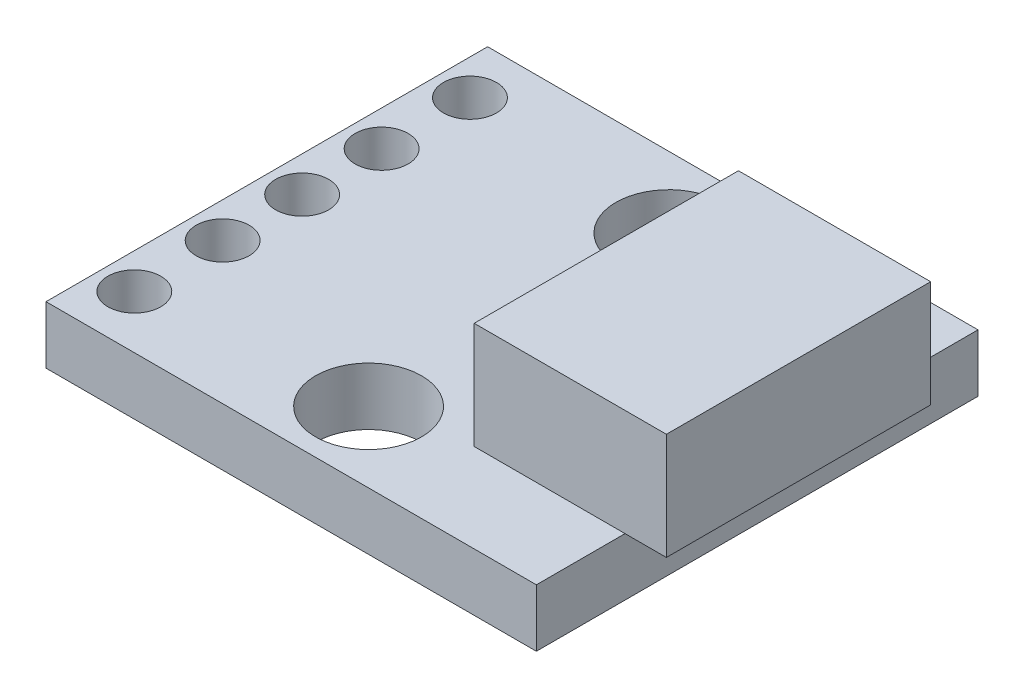
ISO-10303-21;
HEADER;
FILE_DESCRIPTION(('STEP AP214'),'2;1');
FILE_NAME('part.step','',(''),(''),'','','');
FILE_SCHEMA(('AUTOMOTIVE_DESIGN { 1 0 10303 214 1 1 1 1 }'));
ENDSEC;
DATA;
#1=APPLICATION_CONTEXT('core data for automotive mechanical design processes');
#2=APPLICATION_PROTOCOL_DEFINITION('international standard','automotive_design',2000,#1);
#3=PRODUCT_CONTEXT('',#1,'mechanical');
#4=PRODUCT('Part','Part','',(#3));
#5=PRODUCT_RELATED_PRODUCT_CATEGORY('part','',(#4));
#6=PRODUCT_DEFINITION_FORMATION('','',#4);
#7=PRODUCT_DEFINITION_CONTEXT('part definition',#1,'design');
#8=PRODUCT_DEFINITION('design','',#6,#7);
#9=PRODUCT_DEFINITION_SHAPE('','',#8);
#10=(LENGTH_UNIT() NAMED_UNIT(*) SI_UNIT(.MILLI.,.METRE.));
#11=(NAMED_UNIT(*) PLANE_ANGLE_UNIT() SI_UNIT($,.RADIAN.));
#12=(NAMED_UNIT(*) SI_UNIT($,.STERADIAN.) SOLID_ANGLE_UNIT());
#13=UNCERTAINTY_MEASURE_WITH_UNIT(LENGTH_MEASURE(1.E-05),#10,'distance_accuracy_value','');
#14=(GEOMETRIC_REPRESENTATION_CONTEXT(3) GLOBAL_UNCERTAINTY_ASSIGNED_CONTEXT((#13)) GLOBAL_UNIT_ASSIGNED_CONTEXT((#10,
#11,#12)) REPRESENTATION_CONTEXT('',''));
#15=CARTESIAN_POINT('',(0.,0.,0.));
#16=DIRECTION('',(0.,0.,1.));
#17=DIRECTION('',(1.,0.,0.));
#18=AXIS2_PLACEMENT_3D('',#15,#16,#17);
#19=CARTESIAN_POINT('',(5.39,1.63,0.));
#20=DIRECTION('',(0.,1.,0.));
#21=DIRECTION('',(0.,0.,1.));
#22=AXIS2_PLACEMENT_3D('',#19,#20,#21);
#23=PLANE('',#22);
#24=DIRECTION('',(0.,0.,-1.));
#25=VECTOR('',#24,1.);
#26=CARTESIAN_POINT('',(8.11,1.63,3.74));
#27=LINE('',#26,#25);
#28=CARTESIAN_POINT('',(8.11,1.63,3.74));
#29=VERTEX_POINT('',#28);
#30=CARTESIAN_POINT('',(8.11,1.63,-3.74));
#31=VERTEX_POINT('',#30);
#32=EDGE_CURVE('P0_E78',#29,#31,#27,.T.);
#33=ORIENTED_EDGE('',*,*,#32,.F.);
#34=DIRECTION('',(1.,0.,0.));
#35=VECTOR('',#34,1.);
#36=CARTESIAN_POINT('',(2.67,1.63,3.74));
#37=LINE('',#36,#35);
#38=CARTESIAN_POINT('',(2.67,1.63,3.74));
#39=VERTEX_POINT('',#38);
#40=EDGE_CURVE('P0_E54',#39,#29,#37,.T.);
#41=ORIENTED_EDGE('',*,*,#40,.F.);
#42=DIRECTION('',(0.,0.,1.));
#43=VECTOR('',#42,1.);
#44=CARTESIAN_POINT('',(2.67,1.63,-3.74));
#45=LINE('',#44,#43);
#46=CARTESIAN_POINT('',(2.67,1.63,-3.74));
#47=VERTEX_POINT('',#46);
#48=EDGE_CURVE('P0_E56',#47,#39,#45,.T.);
#49=ORIENTED_EDGE('',*,*,#48,.F.);
#50=DIRECTION('',(-1.,0.,0.));
#51=VECTOR('',#50,1.);
#52=CARTESIAN_POINT('',(8.11,1.63,-3.74));
#53=LINE('',#52,#51);
#54=EDGE_CURVE('P0_E19',#31,#47,#53,.T.);
#55=ORIENTED_EDGE('',*,*,#54,.F.);
#56=EDGE_LOOP('',(#33,#41,#49,#55));
#57=FACE_BOUND('',#56,.T.);
#58=ADVANCED_FACE('P0_F16',(#57),#23,.F.);
#59=CARTESIAN_POINT('',(8.11,1.63,-3.74));
#60=DIRECTION('',(0.,0.,-1.));
#61=DIRECTION('',(-1.,0.,0.));
#62=AXIS2_PLACEMENT_3D('',#59,#60,#61);
#63=PLANE('',#62);
#64=DIRECTION('',(1.,0.,0.));
#65=VECTOR('',#64,1.);
#66=CARTESIAN_POINT('',(5.39,4.65,-3.74));
#67=LINE('',#66,#65);
#68=CARTESIAN_POINT('',(8.11,4.65,-3.74));
#69=VERTEX_POINT('',#68);
#70=CARTESIAN_POINT('',(2.67,4.65,-3.74));
#71=VERTEX_POINT('',#70);
#72=EDGE_CURVE('P0_E82',#69,#71,#67,.F.);
#73=ORIENTED_EDGE('',*,*,#72,.F.);
#74=DIRECTION('',(0.,1.,0.));
#75=VECTOR('',#74,1.);
#76=CARTESIAN_POINT('',(8.11,1.63,-3.74));
#77=LINE('',#76,#75);
#78=EDGE_CURVE('P0_E67',#31,#69,#77,.T.);
#79=ORIENTED_EDGE('',*,*,#78,.F.);
#80=ORIENTED_EDGE('',*,*,#54,.T.);
#81=DIRECTION('',(0.,1.,0.));
#82=VECTOR('',#81,1.);
#83=CARTESIAN_POINT('',(2.67,1.63,-3.74));
#84=LINE('',#83,#82);
#85=EDGE_CURVE('P0_E62',#71,#47,#84,.F.);
#86=ORIENTED_EDGE('',*,*,#85,.F.);
#87=EDGE_LOOP('',(#73,#79,#80,#86));
#88=FACE_BOUND('',#87,.T.);
#89=ADVANCED_FACE('P0_F64',(#88),#63,.T.);
#90=CARTESIAN_POINT('',(2.67,1.63,-3.74));
#91=DIRECTION('',(-1.,0.,0.));
#92=DIRECTION('',(0.,0.,1.));
#93=AXIS2_PLACEMENT_3D('',#90,#91,#92);
#94=PLANE('',#93);
#95=DIRECTION('',(0.,0.,1.));
#96=VECTOR('',#95,1.);
#97=CARTESIAN_POINT('',(2.67,4.65,0.));
#98=LINE('',#97,#96);
#99=CARTESIAN_POINT('',(2.67,4.65,3.74));
#100=VERTEX_POINT('',#99);
#101=EDGE_CURVE('P0_E71',#71,#100,#98,.T.);
#102=ORIENTED_EDGE('',*,*,#101,.F.);
#103=ORIENTED_EDGE('',*,*,#85,.T.);
#104=ORIENTED_EDGE('',*,*,#48,.T.);
#105=DIRECTION('',(0.,1.,0.));
#106=VECTOR('',#105,1.);
#107=CARTESIAN_POINT('',(2.67,1.63,3.74));
#108=LINE('',#107,#106);
#109=EDGE_CURVE('P0_E74',#100,#39,#108,.F.);
#110=ORIENTED_EDGE('',*,*,#109,.F.);
#111=EDGE_LOOP('',(#102,#103,#104,#110));
#112=FACE_BOUND('',#111,.T.);
#113=ADVANCED_FACE('P0_F69',(#112),#94,.T.);
#114=CARTESIAN_POINT('',(2.67,1.63,3.74));
#115=DIRECTION('',(0.,0.,1.));
#116=DIRECTION('',(1.,0.,0.));
#117=AXIS2_PLACEMENT_3D('',#114,#115,#116);
#118=PLANE('',#117);
#119=DIRECTION('',(1.,0.,0.));
#120=VECTOR('',#119,1.);
#121=CARTESIAN_POINT('',(5.39,4.65,3.74));
#122=LINE('',#121,#120);
#123=CARTESIAN_POINT('',(8.11,4.65,3.74));
#124=VERTEX_POINT('',#123);
#125=EDGE_CURVE('P0_E25',#100,#124,#122,.T.);
#126=ORIENTED_EDGE('',*,*,#125,.F.);
#127=ORIENTED_EDGE('',*,*,#109,.T.);
#128=ORIENTED_EDGE('',*,*,#40,.T.);
#129=DIRECTION('',(0.,1.,0.));
#130=VECTOR('',#129,1.);
#131=CARTESIAN_POINT('',(8.11,1.63,3.74));
#132=LINE('',#131,#130);
#133=EDGE_CURVE('P0_E34',#124,#29,#132,.F.);
#134=ORIENTED_EDGE('',*,*,#133,.F.);
#135=EDGE_LOOP('',(#126,#127,#128,#134));
#136=FACE_BOUND('',#135,.T.);
#137=ADVANCED_FACE('P0_F88',(#136),#118,.T.);
#138=CARTESIAN_POINT('',(8.11,1.63,3.74));
#139=DIRECTION('',(1.,0.,0.));
#140=DIRECTION('',(0.,0.,-1.));
#141=AXIS2_PLACEMENT_3D('',#138,#139,#140);
#142=PLANE('',#141);
#143=DIRECTION('',(0.,0.,1.));
#144=VECTOR('',#143,1.);
#145=CARTESIAN_POINT('',(8.11,4.65,0.));
#146=LINE('',#145,#144);
#147=EDGE_CURVE('P0_E10',#124,#69,#146,.F.);
#148=ORIENTED_EDGE('',*,*,#147,.F.);
#149=ORIENTED_EDGE('',*,*,#133,.T.);
#150=ORIENTED_EDGE('',*,*,#32,.T.);
#151=ORIENTED_EDGE('',*,*,#78,.T.);
#152=EDGE_LOOP('',(#148,#149,#150,#151));
#153=FACE_BOUND('',#152,.T.);
#154=ADVANCED_FACE('P0_F90',(#153),#142,.T.);
#155=CARTESIAN_POINT('',(5.39,4.65,0.));
#156=DIRECTION('',(0.,1.,0.));
#157=DIRECTION('',(0.,0.,1.));
#158=AXIS2_PLACEMENT_3D('',#155,#156,#157);
#159=PLANE('',#158);
#160=ORIENTED_EDGE('',*,*,#125,.T.);
#161=ORIENTED_EDGE('',*,*,#147,.T.);
#162=ORIENTED_EDGE('',*,*,#72,.T.);
#163=ORIENTED_EDGE('',*,*,#101,.T.);
#164=EDGE_LOOP('',(#160,#161,#162,#163));
#165=FACE_BOUND('',#164,.T.);
#166=ADVANCED_FACE('P0_F87',(#165),#159,.T.);
#167=CLOSED_SHELL('',(#58,#89,#113,#137,#154,#166));
#168=MANIFOLD_SOLID_BREP('P0_B1',#167);
#169=CARTESIAN_POINT('',(0.,0.,0.));
#170=DIRECTION('',(0.,1.,0.));
#171=DIRECTION('',(0.,0.,1.));
#172=AXIS2_PLACEMENT_3D('',#169,#170,#171);
#173=PLANE('',#172);
#174=CARTESIAN_POINT('',(0.19,0.,4.25));
#175=DIRECTION('',(0.,-1.,0.));
#176=DIRECTION('',(0.,0.,-1.));
#177=AXIS2_PLACEMENT_3D('',#174,#175,#176);
#178=CIRCLE('',#177,1.5);
#179=CARTESIAN_POINT('',(0.19,0.,2.75));
#180=VERTEX_POINT('',#179);
#181=EDGE_CURVE('P1_E100',#180,#180,#178,.F.);
#182=ORIENTED_EDGE('',*,*,#181,.T.);
#183=EDGE_LOOP('',(#182));
#184=FACE_BOUND('',#183,.T.);
#185=CARTESIAN_POINT('',(0.19,0.,-4.25));
#186=DIRECTION('',(0.,-1.,0.));
#187=DIRECTION('',(0.,0.,-1.));
#188=AXIS2_PLACEMENT_3D('',#185,#186,#187);
#189=CIRCLE('',#188,1.5);
#190=CARTESIAN_POINT('',(0.19,0.,-5.75));
#191=VERTEX_POINT('',#190);
#192=EDGE_CURVE('P1_E104',#191,#191,#189,.F.);
#193=ORIENTED_EDGE('',*,*,#192,.T.);
#194=EDGE_LOOP('',(#193));
#195=FACE_BOUND('',#194,.T.);
#196=CARTESIAN_POINT('',(-5.94,0.,4.75));
#197=DIRECTION('',(0.,-1.,0.));
#198=DIRECTION('',(0.,0.,-1.));
#199=AXIS2_PLACEMENT_3D('',#196,#197,#198);
#200=CIRCLE('',#199,0.750000000000001);
#201=CARTESIAN_POINT('',(-5.94,0.,4.));
#202=VERTEX_POINT('',#201);
#203=EDGE_CURVE('P1_E107',#202,#202,#200,.F.);
#204=ORIENTED_EDGE('',*,*,#203,.T.);
#205=EDGE_LOOP('',(#204));
#206=FACE_BOUND('',#205,.T.);
#207=CARTESIAN_POINT('',(-5.94,0.,-4.75));
#208=DIRECTION('',(0.,-1.,0.));
#209=DIRECTION('',(0.,0.,-1.));
#210=AXIS2_PLACEMENT_3D('',#207,#208,#209);
#211=CIRCLE('',#210,0.750000000000001);
#212=CARTESIAN_POINT('',(-5.94,0.,-5.5));
#213=VERTEX_POINT('',#212);
#214=EDGE_CURVE('P1_E110',#213,#213,#211,.F.);
#215=ORIENTED_EDGE('',*,*,#214,.T.);
#216=EDGE_LOOP('',(#215));
#217=FACE_BOUND('',#216,.T.);
#218=CARTESIAN_POINT('',(-5.94,0.,2.25));
#219=DIRECTION('',(0.,-1.,0.));
#220=DIRECTION('',(0.,0.,-1.));
#221=AXIS2_PLACEMENT_3D('',#218,#219,#220);
#222=CIRCLE('',#221,0.75);
#223=CARTESIAN_POINT('',(-5.94,0.,1.5));
#224=VERTEX_POINT('',#223);
#225=EDGE_CURVE('P1_E113',#224,#224,#222,.F.);
#226=ORIENTED_EDGE('',*,*,#225,.T.);
#227=EDGE_LOOP('',(#226));
#228=FACE_BOUND('',#227,.T.);
#229=CARTESIAN_POINT('',(-5.94,0.,-2.25));
#230=DIRECTION('',(0.,-1.,0.));
#231=DIRECTION('',(0.,0.,-1.));
#232=AXIS2_PLACEMENT_3D('',#229,#230,#231);
#233=CIRCLE('',#232,0.75);
#234=CARTESIAN_POINT('',(-5.94,0.,-3.));
#235=VERTEX_POINT('',#234);
#236=EDGE_CURVE('P1_E115',#235,#235,#233,.F.);
#237=ORIENTED_EDGE('',*,*,#236,.T.);
#238=EDGE_LOOP('',(#237));
#239=FACE_BOUND('',#238,.T.);
#240=CARTESIAN_POINT('',(-5.94,0.,0.));
#241=DIRECTION('',(0.,-1.,0.));
#242=DIRECTION('',(0.,0.,-1.));
#243=AXIS2_PLACEMENT_3D('',#240,#241,#242);
#244=CIRCLE('',#243,0.75);
#245=CARTESIAN_POINT('',(-5.94,0.,-0.75));
#246=VERTEX_POINT('',#245);
#247=EDGE_CURVE('P1_E20',#246,#246,#244,.F.);
#248=ORIENTED_EDGE('',*,*,#247,.T.);
#249=EDGE_LOOP('',(#248));
#250=FACE_BOUND('',#249,.T.);
#251=DIRECTION('',(1.,0.,0.));
#252=VECTOR('',#251,1.);
#253=CARTESIAN_POINT('',(-6.94,0.,6.25));
#254=LINE('',#253,#252);
#255=CARTESIAN_POINT('',(-6.94,0.,6.25));
#256=VERTEX_POINT('',#255);
#257=CARTESIAN_POINT('',(6.94,0.,6.25));
#258=VERTEX_POINT('',#257);
#259=EDGE_CURVE('P1_E124',#256,#258,#254,.T.);
#260=ORIENTED_EDGE('',*,*,#259,.F.);
#261=DIRECTION('',(0.,0.,1.));
#262=VECTOR('',#261,1.);
#263=CARTESIAN_POINT('',(-6.94,0.,-6.25));
#264=LINE('',#263,#262);
#265=CARTESIAN_POINT('',(-6.94,0.,-6.25));
#266=VERTEX_POINT('',#265);
#267=EDGE_CURVE('P1_E55',#266,#256,#264,.T.);
#268=ORIENTED_EDGE('',*,*,#267,.F.);
#269=DIRECTION('',(-1.,0.,0.));
#270=VECTOR('',#269,1.);
#271=CARTESIAN_POINT('',(6.94,0.,-6.25));
#272=LINE('',#271,#270);
#273=CARTESIAN_POINT('',(6.94,0.,-6.25));
#274=VERTEX_POINT('',#273);
#275=EDGE_CURVE('P1_E57',#274,#266,#272,.T.);
#276=ORIENTED_EDGE('',*,*,#275,.F.);
#277=DIRECTION('',(0.,0.,-1.));
#278=VECTOR('',#277,1.);
#279=CARTESIAN_POINT('',(6.94,0.,6.25));
#280=LINE('',#279,#278);
#281=EDGE_CURVE('P1_E59',#258,#274,#280,.T.);
#282=ORIENTED_EDGE('',*,*,#281,.F.);
#283=EDGE_LOOP('',(#260,#268,#276,#282));
#284=FACE_BOUND('',#283,.T.);
#285=ADVANCED_FACE('P1_F17',(#184,#195,#206,#217,#228,#239,#250,#284),#173,.F.);
#286=CARTESIAN_POINT('',(6.94,0.,6.25));
#287=DIRECTION('',(1.,0.,0.));
#288=DIRECTION('',(0.,0.,-1.));
#289=AXIS2_PLACEMENT_3D('',#286,#287,#288);
#290=PLANE('',#289);
#291=DIRECTION('',(0.,0.,1.));
#292=VECTOR('',#291,1.);
#293=CARTESIAN_POINT('',(6.94,1.63,0.));
#294=LINE('',#293,#292);
#295=CARTESIAN_POINT('',(6.94,1.63,6.25));
#296=VERTEX_POINT('',#295);
#297=CARTESIAN_POINT('',(6.94,1.63,-6.25));
#298=VERTEX_POINT('',#297);
#299=EDGE_CURVE('P1_E103',#296,#298,#294,.F.);
#300=ORIENTED_EDGE('',*,*,#299,.F.);
#301=DIRECTION('',(0.,1.,0.));
#302=VECTOR('',#301,1.);
#303=CARTESIAN_POINT('',(6.94,0.,6.25));
#304=LINE('',#303,#302);
#305=EDGE_CURVE('P1_E70',#258,#296,#304,.T.);
#306=ORIENTED_EDGE('',*,*,#305,.F.);
#307=ORIENTED_EDGE('',*,*,#281,.T.);
#308=DIRECTION('',(0.,1.,0.));
#309=VECTOR('',#308,1.);
#310=CARTESIAN_POINT('',(6.94,0.,-6.25));
#311=LINE('',#310,#309);
#312=EDGE_CURVE('P1_E64',#298,#274,#311,.F.);
#313=ORIENTED_EDGE('',*,*,#312,.F.);
#314=EDGE_LOOP('',(#300,#306,#307,#313));
#315=FACE_BOUND('',#314,.T.);
#316=ADVANCED_FACE('P1_F67',(#315),#290,.T.);
#317=CARTESIAN_POINT('',(6.94,0.,-6.25));
#318=DIRECTION('',(0.,0.,-1.));
#319=DIRECTION('',(-1.,0.,0.));
#320=AXIS2_PLACEMENT_3D('',#317,#318,#319);
#321=PLANE('',#320);
#322=DIRECTION('',(1.,0.,0.));
#323=VECTOR('',#322,1.);
#324=CARTESIAN_POINT('',(0.,1.63,-6.25));
#325=LINE('',#324,#323);
#326=CARTESIAN_POINT('',(-6.94,1.63,-6.25));
#327=VERTEX_POINT('',#326);
#328=EDGE_CURVE('P1_E75',#298,#327,#325,.F.);
#329=ORIENTED_EDGE('',*,*,#328,.F.);
#330=ORIENTED_EDGE('',*,*,#312,.T.);
#331=ORIENTED_EDGE('',*,*,#275,.T.);
#332=DIRECTION('',(0.,1.,0.));
#333=VECTOR('',#332,1.);
#334=CARTESIAN_POINT('',(-6.94,0.,-6.25));
#335=LINE('',#334,#333);
#336=EDGE_CURVE('P1_E78',#327,#266,#335,.F.);
#337=ORIENTED_EDGE('',*,*,#336,.F.);
#338=EDGE_LOOP('',(#329,#330,#331,#337));
#339=FACE_BOUND('',#338,.T.);
#340=ADVANCED_FACE('P1_F73',(#339),#321,.T.);
#341=CARTESIAN_POINT('',(-6.94,0.,-6.25));
#342=DIRECTION('',(-1.,0.,0.));
#343=DIRECTION('',(0.,0.,1.));
#344=AXIS2_PLACEMENT_3D('',#341,#342,#343);
#345=PLANE('',#344);
#346=DIRECTION('',(0.,0.,1.));
#347=VECTOR('',#346,1.);
#348=CARTESIAN_POINT('',(-6.94,1.63,0.));
#349=LINE('',#348,#347);
#350=CARTESIAN_POINT('',(-6.94,1.63,6.25));
#351=VERTEX_POINT('',#350);
#352=EDGE_CURVE('P1_E131',#327,#351,#349,.T.);
#353=ORIENTED_EDGE('',*,*,#352,.F.);
#354=ORIENTED_EDGE('',*,*,#336,.T.);
#355=ORIENTED_EDGE('',*,*,#267,.T.);
#356=DIRECTION('',(0.,1.,0.));
#357=VECTOR('',#356,1.);
#358=CARTESIAN_POINT('',(-6.94,0.,6.25));
#359=LINE('',#358,#357);
#360=EDGE_CURVE('P1_E35',#351,#256,#359,.F.);
#361=ORIENTED_EDGE('',*,*,#360,.F.);
#362=EDGE_LOOP('',(#353,#354,#355,#361));
#363=FACE_BOUND('',#362,.T.);
#364=ADVANCED_FACE('P1_F129',(#363),#345,.T.);
#365=CARTESIAN_POINT('',(-6.94,0.,6.25));
#366=DIRECTION('',(0.,0.,1.));
#367=DIRECTION('',(1.,0.,0.));
#368=AXIS2_PLACEMENT_3D('',#365,#366,#367);
#369=PLANE('',#368);
#370=DIRECTION('',(1.,0.,0.));
#371=VECTOR('',#370,1.);
#372=CARTESIAN_POINT('',(0.,1.63,6.25));
#373=LINE('',#372,#371);
#374=EDGE_CURVE('P1_E99',#351,#296,#373,.T.);
#375=ORIENTED_EDGE('',*,*,#374,.F.);
#376=ORIENTED_EDGE('',*,*,#360,.T.);
#377=ORIENTED_EDGE('',*,*,#259,.T.);
#378=ORIENTED_EDGE('',*,*,#305,.T.);
#379=EDGE_LOOP('',(#375,#376,#377,#378));
#380=FACE_BOUND('',#379,.T.);
#381=ADVANCED_FACE('P1_F137',(#380),#369,.T.);
#382=CARTESIAN_POINT('',(-5.94,1.63,0.));
#383=DIRECTION('',(0.,-1.,0.));
#384=DIRECTION('',(0.,0.,-1.));
#385=AXIS2_PLACEMENT_3D('',#382,#383,#384);
#386=CYLINDRICAL_SURFACE('',#385,0.75);
#387=ORIENTED_EDGE('',*,*,#247,.F.);
#388=EDGE_LOOP('',(#387));
#389=FACE_BOUND('',#388,.T.);
#390=CARTESIAN_POINT('',(-5.94,1.63,0.));
#391=DIRECTION('',(0.,-1.,0.));
#392=DIRECTION('',(0.,0.,-1.));
#393=AXIS2_PLACEMENT_3D('',#390,#391,#392);
#394=CIRCLE('',#393,0.75);
#395=CARTESIAN_POINT('',(-5.94,1.63,-0.75));
#396=VERTEX_POINT('',#395);
#397=EDGE_CURVE('P1_E96',#396,#396,#394,.T.);
#398=ORIENTED_EDGE('',*,*,#397,.F.);
#399=EDGE_LOOP('',(#398));
#400=FACE_BOUND('',#399,.T.);
#401=ADVANCED_FACE('P1_F139',(#389,#400),#386,.F.);
#402=CARTESIAN_POINT('',(-5.94,1.63,-2.25));
#403=DIRECTION('',(0.,-1.,0.));
#404=DIRECTION('',(0.,0.,-1.));
#405=AXIS2_PLACEMENT_3D('',#402,#403,#404);
#406=CYLINDRICAL_SURFACE('',#405,0.75);
#407=ORIENTED_EDGE('',*,*,#236,.F.);
#408=EDGE_LOOP('',(#407));
#409=FACE_BOUND('',#408,.T.);
#410=CARTESIAN_POINT('',(-5.94,1.63,-2.25));
#411=DIRECTION('',(0.,-1.,0.));
#412=DIRECTION('',(0.,0.,-1.));
#413=AXIS2_PLACEMENT_3D('',#410,#411,#412);
#414=CIRCLE('',#413,0.75);
#415=CARTESIAN_POINT('',(-5.94,1.63,-3.));
#416=VERTEX_POINT('',#415);
#417=EDGE_CURVE('P1_E93',#416,#416,#414,.T.);
#418=ORIENTED_EDGE('',*,*,#417,.F.);
#419=EDGE_LOOP('',(#418));
#420=FACE_BOUND('',#419,.T.);
#421=ADVANCED_FACE('P1_F146',(#409,#420),#406,.F.);
#422=CARTESIAN_POINT('',(-5.94,1.63,2.25));
#423=DIRECTION('',(0.,-1.,0.));
#424=DIRECTION('',(0.,0.,-1.));
#425=AXIS2_PLACEMENT_3D('',#422,#423,#424);
#426=CYLINDRICAL_SURFACE('',#425,0.75);
#427=ORIENTED_EDGE('',*,*,#225,.F.);
#428=EDGE_LOOP('',(#427));
#429=FACE_BOUND('',#428,.T.);
#430=CARTESIAN_POINT('',(-5.94,1.63,2.25));
#431=DIRECTION('',(0.,-1.,0.));
#432=DIRECTION('',(0.,0.,-1.));
#433=AXIS2_PLACEMENT_3D('',#430,#431,#432);
#434=CIRCLE('',#433,0.75);
#435=CARTESIAN_POINT('',(-5.94,1.63,1.5));
#436=VERTEX_POINT('',#435);
#437=EDGE_CURVE('P1_E90',#436,#436,#434,.T.);
#438=ORIENTED_EDGE('',*,*,#437,.F.);
#439=EDGE_LOOP('',(#438));
#440=FACE_BOUND('',#439,.T.);
#441=ADVANCED_FACE('P1_F172',(#429,#440),#426,.F.);
#442=CARTESIAN_POINT('',(-5.94,1.63,-4.75));
#443=DIRECTION('',(0.,-1.,0.));
#444=DIRECTION('',(0.,0.,-1.));
#445=AXIS2_PLACEMENT_3D('',#442,#443,#444);
#446=CYLINDRICAL_SURFACE('',#445,0.750000000000001);
#447=ORIENTED_EDGE('',*,*,#214,.F.);
#448=EDGE_LOOP('',(#447));
#449=FACE_BOUND('',#448,.T.);
#450=CARTESIAN_POINT('',(-5.94,1.63,-4.75));
#451=DIRECTION('',(0.,-1.,0.));
#452=DIRECTION('',(0.,0.,-1.));
#453=AXIS2_PLACEMENT_3D('',#450,#451,#452);
#454=CIRCLE('',#453,0.750000000000001);
#455=CARTESIAN_POINT('',(-5.94,1.63,-5.5));
#456=VERTEX_POINT('',#455);
#457=EDGE_CURVE('P1_E87',#456,#456,#454,.T.);
#458=ORIENTED_EDGE('',*,*,#457,.F.);
#459=EDGE_LOOP('',(#458));
#460=FACE_BOUND('',#459,.T.);
#461=ADVANCED_FACE('P1_F168',(#449,#460),#446,.F.);
#462=CARTESIAN_POINT('',(-5.94,1.63,4.75));
#463=DIRECTION('',(0.,-1.,0.));
#464=DIRECTION('',(0.,0.,-1.));
#465=AXIS2_PLACEMENT_3D('',#462,#463,#464);
#466=CYLINDRICAL_SURFACE('',#465,0.750000000000001);
#467=ORIENTED_EDGE('',*,*,#203,.F.);
#468=EDGE_LOOP('',(#467));
#469=FACE_BOUND('',#468,.T.);
#470=CARTESIAN_POINT('',(-5.94,1.63,4.75));
#471=DIRECTION('',(0.,-1.,0.));
#472=DIRECTION('',(0.,0.,-1.));
#473=AXIS2_PLACEMENT_3D('',#470,#471,#472);
#474=CIRCLE('',#473,0.750000000000001);
#475=CARTESIAN_POINT('',(-5.94,1.63,4.));
#476=VERTEX_POINT('',#475);
#477=EDGE_CURVE('P1_E84',#476,#476,#474,.T.);
#478=ORIENTED_EDGE('',*,*,#477,.F.);
#479=EDGE_LOOP('',(#478));
#480=FACE_BOUND('',#479,.T.);
#481=ADVANCED_FACE('P1_F164',(#469,#480),#466,.F.);
#482=CARTESIAN_POINT('',(0.19,1.63,-4.25));
#483=DIRECTION('',(0.,-1.,0.));
#484=DIRECTION('',(0.,0.,-1.));
#485=AXIS2_PLACEMENT_3D('',#482,#483,#484);
#486=CYLINDRICAL_SURFACE('',#485,1.5);
#487=ORIENTED_EDGE('',*,*,#192,.F.);
#488=EDGE_LOOP('',(#487));
#489=FACE_BOUND('',#488,.T.);
#490=CARTESIAN_POINT('',(0.19,1.63,-4.25));
#491=DIRECTION('',(0.,-1.,0.));
#492=DIRECTION('',(0.,0.,-1.));
#493=AXIS2_PLACEMENT_3D('',#490,#491,#492);
#494=CIRCLE('',#493,1.5);
#495=CARTESIAN_POINT('',(0.19,1.63,-5.75));
#496=VERTEX_POINT('',#495);
#497=EDGE_CURVE('P1_E26',#496,#496,#494,.T.);
#498=ORIENTED_EDGE('',*,*,#497,.F.);
#499=EDGE_LOOP('',(#498));
#500=FACE_BOUND('',#499,.T.);
#501=ADVANCED_FACE('P1_F157',(#489,#500),#486,.F.);
#502=CARTESIAN_POINT('',(0.19,1.63,4.25));
#503=DIRECTION('',(0.,-1.,0.));
#504=DIRECTION('',(0.,0.,-1.));
#505=AXIS2_PLACEMENT_3D('',#502,#503,#504);
#506=CYLINDRICAL_SURFACE('',#505,1.5);
#507=ORIENTED_EDGE('',*,*,#181,.F.);
#508=EDGE_LOOP('',(#507));
#509=FACE_BOUND('',#508,.T.);
#510=CARTESIAN_POINT('',(0.19,1.63,4.25));
#511=DIRECTION('',(0.,-1.,0.));
#512=DIRECTION('',(0.,0.,-1.));
#513=AXIS2_PLACEMENT_3D('',#510,#511,#512);
#514=CIRCLE('',#513,1.5);
#515=CARTESIAN_POINT('',(0.19,1.63,2.75));
#516=VERTEX_POINT('',#515);
#517=EDGE_CURVE('P1_E11',#516,#516,#514,.T.);
#518=ORIENTED_EDGE('',*,*,#517,.F.);
#519=EDGE_LOOP('',(#518));
#520=FACE_BOUND('',#519,.T.);
#521=ADVANCED_FACE('P1_F151',(#509,#520),#506,.F.);
#522=CARTESIAN_POINT('',(0.,1.63,0.));
#523=DIRECTION('',(0.,1.,0.));
#524=DIRECTION('',(0.,0.,1.));
#525=AXIS2_PLACEMENT_3D('',#522,#523,#524);
#526=PLANE('',#525);
#527=ORIENTED_EDGE('',*,*,#517,.T.);
#528=EDGE_LOOP('',(#527));
#529=FACE_BOUND('',#528,.T.);
#530=ORIENTED_EDGE('',*,*,#497,.T.);
#531=EDGE_LOOP('',(#530));
#532=FACE_BOUND('',#531,.T.);
#533=ORIENTED_EDGE('',*,*,#477,.T.);
#534=EDGE_LOOP('',(#533));
#535=FACE_BOUND('',#534,.T.);
#536=ORIENTED_EDGE('',*,*,#457,.T.);
#537=EDGE_LOOP('',(#536));
#538=FACE_BOUND('',#537,.T.);
#539=ORIENTED_EDGE('',*,*,#437,.T.);
#540=EDGE_LOOP('',(#539));
#541=FACE_BOUND('',#540,.T.);
#542=ORIENTED_EDGE('',*,*,#417,.T.);
#543=EDGE_LOOP('',(#542));
#544=FACE_BOUND('',#543,.T.);
#545=ORIENTED_EDGE('',*,*,#397,.T.);
#546=EDGE_LOOP('',(#545));
#547=FACE_BOUND('',#546,.T.);
#548=ORIENTED_EDGE('',*,*,#352,.T.);
#549=ORIENTED_EDGE('',*,*,#374,.T.);
#550=ORIENTED_EDGE('',*,*,#299,.T.);
#551=ORIENTED_EDGE('',*,*,#328,.T.);
#552=EDGE_LOOP('',(#548,#549,#550,#551));
#553=FACE_BOUND('',#552,.T.);
#554=ADVANCED_FACE('P1_F135',(#529,#532,#535,#538,#541,#544,#547,#553),#526,.T.);
#555=CLOSED_SHELL('',(#285,#316,#340,#364,#381,#401,#421,#441,#461,#481,#501,#521,#554));
#556=MANIFOLD_SOLID_BREP('P1_B1',#555);
#557=ADVANCED_BREP_SHAPE_REPRESENTATION('',(#18,#168,#556),#14);
#558=SHAPE_DEFINITION_REPRESENTATION(#9,#557);
ENDSEC;
END-ISO-10303-21;
